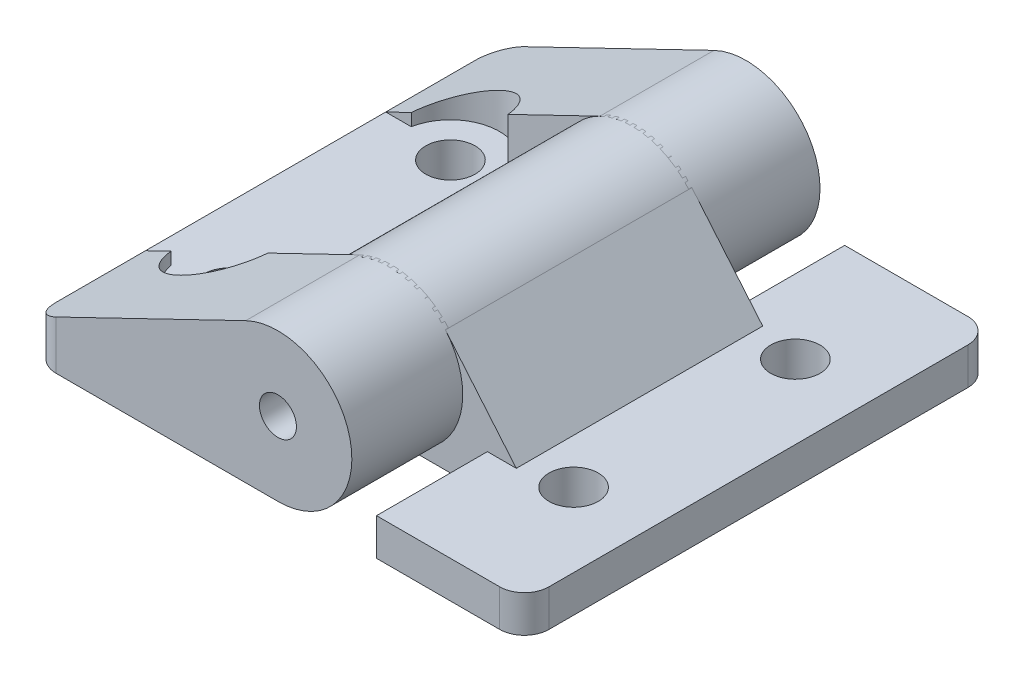
ISO-10303-21;
HEADER;
FILE_DESCRIPTION(('STEP AP214'),'2;1');
FILE_NAME('part.step','',(''),(''),'','','');
FILE_SCHEMA(('AUTOMOTIVE_DESIGN { 1 0 10303 214 1 1 1 1 }'));
ENDSEC;
DATA;
#1=APPLICATION_CONTEXT('core data for automotive mechanical design processes');
#2=APPLICATION_PROTOCOL_DEFINITION('international standard','automotive_design',2000,#1);
#3=PRODUCT_CONTEXT('',#1,'mechanical');
#4=PRODUCT('Part','Part','',(#3));
#5=PRODUCT_RELATED_PRODUCT_CATEGORY('part','',(#4));
#6=PRODUCT_DEFINITION_FORMATION('','',#4);
#7=PRODUCT_DEFINITION_CONTEXT('part definition',#1,'design');
#8=PRODUCT_DEFINITION('design','',#6,#7);
#9=PRODUCT_DEFINITION_SHAPE('','',#8);
#10=(LENGTH_UNIT() NAMED_UNIT(*) SI_UNIT(.MILLI.,.METRE.));
#11=(NAMED_UNIT(*) PLANE_ANGLE_UNIT() SI_UNIT($,.RADIAN.));
#12=(NAMED_UNIT(*) SI_UNIT($,.STERADIAN.) SOLID_ANGLE_UNIT());
#13=UNCERTAINTY_MEASURE_WITH_UNIT(LENGTH_MEASURE(1.E-05),#10,'distance_accuracy_value','');
#14=(GEOMETRIC_REPRESENTATION_CONTEXT(3) GLOBAL_UNCERTAINTY_ASSIGNED_CONTEXT((#13)) GLOBAL_UNIT_ASSIGNED_CONTEXT((#10,
#11,#12)) REPRESENTATION_CONTEXT('',''));
#15=CARTESIAN_POINT('',(0.,0.,0.));
#16=DIRECTION('',(0.,0.,1.));
#17=DIRECTION('',(1.,0.,0.));
#18=AXIS2_PLACEMENT_3D('',#15,#16,#17);
#19=CARTESIAN_POINT('',(-20.,-3.,19.));
#20=DIRECTION('',(0.435060204761574,-0.900401365077162,0.));
#21=DIRECTION('',(0.900401365077162,0.435060204761574,0.));
#22=AXIS2_PLACEMENT_3D('',#19,#20,#21);
#23=PLANE('',#22);
#24=DIRECTION('',(-0.900401365077162,-0.435060204761574,0.));
#25=VECTOR('',#24,1.);
#26=CARTESIAN_POINT('',(-20.,-3.,-19.));
#27=LINE('',#26,#25);
#28=CARTESIAN_POINT('',(-2.61036122856945,5.40240819046297,-19.));
#29=VERTEX_POINT('',#28);
#30=CARTESIAN_POINT('',(-18.,-2.03363050826941,-19.));
#31=VERTEX_POINT('',#30);
#32=EDGE_CURVE('E222',#29,#31,#27,.T.);
#33=ORIENTED_EDGE('',*,*,#32,.T.);
#34=CARTESIAN_POINT('',(-18.,-2.03363050826941,-17.));
#35=DIRECTION('',(0.435060204761574,-0.900401365077162,0.));
#36=DIRECTION('',(-0.900401365077162,-0.435060204761574,0.));
#37=AXIS2_PLACEMENT_3D('',#34,#35,#36);
#38=ELLIPSE('',#37,2.22123163910197,2.);
#39=CARTESIAN_POINT('',(-20.,-3.,-17.));
#40=VERTEX_POINT('',#39);
#41=EDGE_CURVE('E270',#31,#40,#38,.F.);
#42=ORIENTED_EDGE('',*,*,#41,.T.);
#43=DIRECTION('',(0.,0.,-1.));
#44=VECTOR('',#43,1.);
#45=CARTESIAN_POINT('',(-20.,-3.,19.));
#46=LINE('',#45,#44);
#47=CARTESIAN_POINT('',(-20.,-3.,-9.75));
#48=VERTEX_POINT('',#47);
#49=EDGE_CURVE('E234',#48,#40,#46,.T.);
#50=ORIENTED_EDGE('',*,*,#49,.F.);
#51=DIRECTION('',(0.900401365077162,0.435060204761574,0.));
#52=VECTOR('',#51,1.);
#53=CARTESIAN_POINT('',(-20.,-3.,-9.75));
#54=LINE('',#53,#52);
#55=CARTESIAN_POINT('',(-17.9290584113754,-1.99935261479857,-9.75));
#56=VERTEX_POINT('',#55);
#57=EDGE_CURVE('E255',#48,#56,#54,.T.);
#58=ORIENTED_EDGE('',*,*,#57,.T.);
#59=CARTESIAN_POINT('',(-14.,-0.100891524808225,-9.));
#60=DIRECTION('',(0.435060204761574,-0.900401365077162,0.));
#61=DIRECTION('',(-0.900401365077162,-0.435060204761574,0.));
#62=AXIS2_PLACEMENT_3D('',#59,#60,#61);
#63=ELLIPSE('',#62,4.44246327820395,4.);
#64=CARTESIAN_POINT('',(-10.0709415886246,1.79756956518212,-9.75));
#65=VERTEX_POINT('',#64);
#66=EDGE_CURVE('E253',#56,#65,#63,.T.);
#67=ORIENTED_EDGE('',*,*,#66,.T.);
#68=DIRECTION('',(0.900401365077162,0.435060204761574,0.));
#69=VECTOR('',#68,1.);
#70=CARTESIAN_POINT('',(-20.,-3.,-9.75));
#71=LINE('',#70,#69);
#72=CARTESIAN_POINT('',(-2.61036122856944,5.40240819046297,-9.75));
#73=VERTEX_POINT('',#72);
#74=EDGE_CURVE('E200',#65,#73,#71,.T.);
#75=ORIENTED_EDGE('',*,*,#74,.T.);
#76=DIRECTION('',(0.,0.,-1.));
#77=VECTOR('',#76,1.);
#78=CARTESIAN_POINT('',(-2.61036122856945,5.40240819046297,19.));
#79=LINE('',#78,#77);
#80=EDGE_CURVE('E240',#73,#29,#79,.T.);
#81=ORIENTED_EDGE('',*,*,#80,.T.);
#82=EDGE_LOOP('',(#33,#42,#50,#58,#67,#75,#81));
#83=FACE_BOUND('',#82,.T.);
#84=ADVANCED_FACE('F52',(#83),#23,.F.);
#85=CARTESIAN_POINT('',(0.,0.,19.));
#86=DIRECTION('',(0.,0.,-1.));
#87=DIRECTION('',(-1.,0.,0.));
#88=AXIS2_PLACEMENT_3D('',#85,#86,#87);
#89=CYLINDRICAL_SURFACE('',#88,6.);
#90=CARTESIAN_POINT('',(0.,0.,-9.75));
#91=DIRECTION('',(0.,0.,-1.));
#92=DIRECTION('',(-1.,0.,0.));
#93=AXIS2_PLACEMENT_3D('',#90,#91,#92);
#94=CIRCLE('',#93,6.);
#95=CARTESIAN_POINT('',(0.,-6.,-9.75));
#96=VERTEX_POINT('',#95);
#97=EDGE_CURVE('E198',#73,#96,#94,.T.);
#98=ORIENTED_EDGE('',*,*,#97,.T.);
#99=DIRECTION('',(0.,0.,-1.));
#100=VECTOR('',#99,1.);
#101=CARTESIAN_POINT('',(0.,-6.,19.));
#102=LINE('',#101,#100);
#103=CARTESIAN_POINT('',(0.,-6.,-19.));
#104=VERTEX_POINT('',#103);
#105=EDGE_CURVE('E221',#96,#104,#102,.T.);
#106=ORIENTED_EDGE('',*,*,#105,.T.);
#107=CARTESIAN_POINT('',(0.,0.,-19.));
#108=DIRECTION('',(0.,0.,1.));
#109=DIRECTION('',(1.,0.,0.));
#110=AXIS2_PLACEMENT_3D('',#107,#108,#109);
#111=CIRCLE('',#110,6.);
#112=EDGE_CURVE('E212',#104,#29,#111,.T.);
#113=ORIENTED_EDGE('',*,*,#112,.T.);
#114=ORIENTED_EDGE('',*,*,#80,.F.);
#115=EDGE_LOOP('',(#98,#106,#113,#114));
#116=FACE_BOUND('',#115,.T.);
#117=ADVANCED_FACE('F311',(#116),#89,.T.);
#118=CARTESIAN_POINT('',(0.,0.,19.));
#119=DIRECTION('',(0.,0.,-1.));
#120=DIRECTION('',(-1.,0.,0.));
#121=AXIS2_PLACEMENT_3D('',#118,#119,#120);
#122=CYLINDRICAL_SURFACE('',#121,1.5);
#123=CARTESIAN_POINT('',(0.,0.,9.75));
#124=DIRECTION('',(0.,0.,1.));
#125=DIRECTION('',(1.,0.,0.));
#126=AXIS2_PLACEMENT_3D('',#123,#124,#125);
#127=CIRCLE('',#126,1.5);
#128=CARTESIAN_POINT('',(1.5,0.,9.75));
#129=VERTEX_POINT('',#128);
#130=EDGE_CURVE('E201',#129,#129,#127,.T.);
#131=ORIENTED_EDGE('',*,*,#130,.F.);
#132=EDGE_LOOP('',(#131));
#133=FACE_BOUND('',#132,.T.);
#134=CARTESIAN_POINT('',(0.,0.,19.));
#135=DIRECTION('',(0.,0.,1.));
#136=DIRECTION('',(1.,0.,0.));
#137=AXIS2_PLACEMENT_3D('',#134,#135,#136);
#138=CIRCLE('',#137,1.5);
#139=CARTESIAN_POINT('',(1.5,0.,19.));
#140=VERTEX_POINT('',#139);
#141=EDGE_CURVE('E206',#140,#140,#138,.T.);
#142=ORIENTED_EDGE('',*,*,#141,.T.);
#143=EDGE_LOOP('',(#142));
#144=FACE_BOUND('',#143,.T.);
#145=ADVANCED_FACE('F378',(#133,#144),#122,.F.);
#146=CARTESIAN_POINT('',(0.,0.,19.));
#147=DIRECTION('',(0.,0.,1.));
#148=DIRECTION('',(1.,0.,0.));
#149=AXIS2_PLACEMENT_3D('',#146,#147,#148);
#150=PLANE('',#149);
#151=DIRECTION('',(-0.900401365077162,-0.435060204761574,0.));
#152=VECTOR('',#151,1.);
#153=CARTESIAN_POINT('',(-20.,-3.,19.));
#154=LINE('',#153,#152);
#155=CARTESIAN_POINT('',(-2.61036122856945,5.40240819046297,19.));
#156=VERTEX_POINT('',#155);
#157=CARTESIAN_POINT('',(-18.,-2.03363050826941,19.));
#158=VERTEX_POINT('',#157);
#159=EDGE_CURVE('E220',#156,#158,#154,.T.);
#160=ORIENTED_EDGE('',*,*,#159,.T.);
#161=DIRECTION('',(0.,-1.,0.));
#162=VECTOR('',#161,1.);
#163=CARTESIAN_POINT('',(-18.,-6.,19.));
#164=LINE('',#163,#162);
#165=CARTESIAN_POINT('',(-18.,-6.,19.));
#166=VERTEX_POINT('',#165);
#167=EDGE_CURVE('E62',#158,#166,#164,.T.);
#168=ORIENTED_EDGE('',*,*,#167,.T.);
#169=DIRECTION('',(1.,0.,0.));
#170=VECTOR('',#169,1.);
#171=CARTESIAN_POINT('',(0.,-6.,19.));
#172=LINE('',#171,#170);
#173=CARTESIAN_POINT('',(0.,-6.,19.));
#174=VERTEX_POINT('',#173);
#175=EDGE_CURVE('E218',#166,#174,#172,.T.);
#176=ORIENTED_EDGE('',*,*,#175,.T.);
#177=CARTESIAN_POINT('',(0.,0.,19.));
#178=DIRECTION('',(0.,0.,1.));
#179=DIRECTION('',(1.,0.,0.));
#180=AXIS2_PLACEMENT_3D('',#177,#178,#179);
#181=CIRCLE('',#180,6.);
#182=EDGE_CURVE('E211',#174,#156,#181,.T.);
#183=ORIENTED_EDGE('',*,*,#182,.T.);
#184=EDGE_LOOP('',(#160,#168,#176,#183));
#185=FACE_BOUND('',#184,.T.);
#186=ORIENTED_EDGE('',*,*,#141,.F.);
#187=EDGE_LOOP('',(#186));
#188=FACE_BOUND('',#187,.T.);
#189=ADVANCED_FACE('F271',(#185,#188),#150,.T.);
#190=CARTESIAN_POINT('',(0.,0.,-19.));
#191=DIRECTION('',(0.,0.,1.));
#192=DIRECTION('',(1.,0.,0.));
#193=AXIS2_PLACEMENT_3D('',#190,#191,#192);
#194=PLANE('',#193);
#195=DIRECTION('',(1.,0.,0.));
#196=VECTOR('',#195,1.);
#197=CARTESIAN_POINT('',(0.,-6.,-19.));
#198=LINE('',#197,#196);
#199=CARTESIAN_POINT('',(-18.,-6.,-19.));
#200=VERTEX_POINT('',#199);
#201=EDGE_CURVE('E219',#200,#104,#198,.T.);
#202=ORIENTED_EDGE('',*,*,#201,.F.);
#203=DIRECTION('',(0.,-1.,0.));
#204=VECTOR('',#203,1.);
#205=CARTESIAN_POINT('',(-18.,0.,-19.));
#206=LINE('',#205,#204);
#207=EDGE_CURVE('E73',#200,#31,#206,.F.);
#208=ORIENTED_EDGE('',*,*,#207,.T.);
#209=ORIENTED_EDGE('',*,*,#32,.F.);
#210=ORIENTED_EDGE('',*,*,#112,.F.);
#211=EDGE_LOOP('',(#202,#208,#209,#210));
#212=FACE_BOUND('',#211,.T.);
#213=CARTESIAN_POINT('',(0.,0.,-19.));
#214=DIRECTION('',(0.,0.,1.));
#215=DIRECTION('',(1.,0.,0.));
#216=AXIS2_PLACEMENT_3D('',#213,#214,#215);
#217=CIRCLE('',#216,1.5);
#218=CARTESIAN_POINT('',(1.5,0.,-19.));
#219=VERTEX_POINT('',#218);
#220=EDGE_CURVE('E210',#219,#219,#217,.T.);
#221=ORIENTED_EDGE('',*,*,#220,.T.);
#222=EDGE_LOOP('',(#221));
#223=FACE_BOUND('',#222,.T.);
#224=ADVANCED_FACE('F312',(#212,#223),#194,.F.);
#225=CARTESIAN_POINT('',(0.,0.,9.75));
#226=DIRECTION('',(0.,0.,1.));
#227=DIRECTION('',(1.,0.,0.));
#228=AXIS2_PLACEMENT_3D('',#225,#226,#227);
#229=CIRCLE('',#228,6.);
#230=CARTESIAN_POINT('',(0.,-6.,9.75));
#231=VERTEX_POINT('',#230);
#232=CARTESIAN_POINT('',(-2.61036122856944,5.40240819046297,9.75));
#233=VERTEX_POINT('',#232);
#234=EDGE_CURVE('E202',#231,#233,#229,.T.);
#235=ORIENTED_EDGE('',*,*,#234,.T.);
#236=EDGE_CURVE('E237',#156,#233,#79,.T.);
#237=ORIENTED_EDGE('',*,*,#236,.F.);
#238=ORIENTED_EDGE('',*,*,#182,.F.);
#239=EDGE_CURVE('E226',#174,#231,#102,.T.);
#240=ORIENTED_EDGE('',*,*,#239,.T.);
#241=EDGE_LOOP('',(#235,#237,#238,#240));
#242=FACE_BOUND('',#241,.T.);
#243=ADVANCED_FACE('F284',(#242),#89,.T.);
#244=CARTESIAN_POINT('',(-20.,-3.,17.));
#245=VERTEX_POINT('',#244);
#246=CARTESIAN_POINT('',(-20.,-3.,9.75));
#247=VERTEX_POINT('',#246);
#248=EDGE_CURVE('E232',#245,#247,#46,.T.);
#249=ORIENTED_EDGE('',*,*,#248,.F.);
#250=CARTESIAN_POINT('',(-18.,-2.03363050826941,17.));
#251=DIRECTION('',(0.435060204761574,-0.900401365077162,0.));
#252=DIRECTION('',(0.900401365077162,0.435060204761574,0.));
#253=AXIS2_PLACEMENT_3D('',#250,#251,#252);
#254=ELLIPSE('',#253,2.22123163910197,2.);
#255=EDGE_CURVE('E12',#245,#158,#254,.F.);
#256=ORIENTED_EDGE('',*,*,#255,.T.);
#257=ORIENTED_EDGE('',*,*,#159,.F.);
#258=ORIENTED_EDGE('',*,*,#236,.T.);
#259=DIRECTION('',(-0.900401365077162,-0.435060204761574,0.));
#260=VECTOR('',#259,1.);
#261=CARTESIAN_POINT('',(-20.,-3.,9.75));
#262=LINE('',#261,#260);
#263=CARTESIAN_POINT('',(-10.0709415886246,1.79756956518211,9.75));
#264=VERTEX_POINT('',#263);
#265=EDGE_CURVE('E205',#233,#264,#262,.T.);
#266=ORIENTED_EDGE('',*,*,#265,.T.);
#267=CARTESIAN_POINT('',(-14.,-0.100891524808227,9.));
#268=DIRECTION('',(0.435060204761574,-0.900401365077162,0.));
#269=DIRECTION('',(-0.900401365077162,-0.435060204761574,0.));
#270=AXIS2_PLACEMENT_3D('',#267,#268,#269);
#271=ELLIPSE('',#270,4.44246327820395,4.);
#272=CARTESIAN_POINT('',(-17.9290584113754,-1.99935261479856,9.75));
#273=VERTEX_POINT('',#272);
#274=EDGE_CURVE('E245',#264,#273,#271,.T.);
#275=ORIENTED_EDGE('',*,*,#274,.T.);
#276=DIRECTION('',(-0.900401365077162,-0.435060204761574,0.));
#277=VECTOR('',#276,1.);
#278=CARTESIAN_POINT('',(-20.,-3.,9.75));
#279=LINE('',#278,#277);
#280=EDGE_CURVE('E248',#273,#247,#279,.T.);
#281=ORIENTED_EDGE('',*,*,#280,.T.);
#282=EDGE_LOOP('',(#249,#256,#257,#258,#266,#275,#281));
#283=FACE_BOUND('',#282,.T.);
#284=ADVANCED_FACE('F283',(#283),#23,.F.);
#285=CARTESIAN_POINT('',(-20.,-6.,19.));
#286=DIRECTION('',(1.,0.,0.));
#287=DIRECTION('',(0.,0.,-1.));
#288=AXIS2_PLACEMENT_3D('',#285,#286,#287);
#289=PLANE('',#288);
#290=ORIENTED_EDGE('',*,*,#49,.T.);
#291=DIRECTION('',(0.,-1.,0.));
#292=VECTOR('',#291,1.);
#293=CARTESIAN_POINT('',(-20.,-6.,-17.));
#294=LINE('',#293,#292);
#295=CARTESIAN_POINT('',(-20.,-6.,-17.));
#296=VERTEX_POINT('',#295);
#297=EDGE_CURVE('E258',#40,#296,#294,.T.);
#298=ORIENTED_EDGE('',*,*,#297,.T.);
#299=DIRECTION('',(0.,0.,-1.));
#300=VECTOR('',#299,1.);
#301=CARTESIAN_POINT('',(-20.,-6.,19.));
#302=LINE('',#301,#300);
#303=CARTESIAN_POINT('',(-20.,-6.,17.));
#304=VERTEX_POINT('',#303);
#305=EDGE_CURVE('E233',#304,#296,#302,.T.);
#306=ORIENTED_EDGE('',*,*,#305,.F.);
#307=DIRECTION('',(0.,-1.,0.));
#308=VECTOR('',#307,1.);
#309=CARTESIAN_POINT('',(-20.,-3.,17.));
#310=LINE('',#309,#308);
#311=EDGE_CURVE('E259',#304,#245,#310,.F.);
#312=ORIENTED_EDGE('',*,*,#311,.T.);
#313=ORIENTED_EDGE('',*,*,#248,.T.);
#314=EDGE_CURVE('E238',#247,#48,#46,.T.);
#315=ORIENTED_EDGE('',*,*,#314,.T.);
#316=EDGE_LOOP('',(#290,#298,#306,#312,#313,#315));
#317=FACE_BOUND('',#316,.T.);
#318=ADVANCED_FACE('F325',(#317),#289,.F.);
#319=CARTESIAN_POINT('',(0.,-6.,19.));
#320=DIRECTION('',(0.,1.,0.));
#321=DIRECTION('',(-1.,0.,0.));
#322=AXIS2_PLACEMENT_3D('',#319,#320,#321);
#323=PLANE('',#322);
#324=CARTESIAN_POINT('',(-14.,-6.00000000000001,-9.));
#325=DIRECTION('',(0.,1.,0.));
#326=DIRECTION('',(-1.,0.,0.));
#327=AXIS2_PLACEMENT_3D('',#324,#325,#326);
#328=CIRCLE('',#327,2.);
#329=CARTESIAN_POINT('',(-16.,-6.00000000000001,-9.));
#330=VERTEX_POINT('',#329);
#331=EDGE_CURVE('E182',#330,#330,#328,.T.);
#332=ORIENTED_EDGE('',*,*,#331,.T.);
#333=EDGE_LOOP('',(#332));
#334=FACE_BOUND('',#333,.T.);
#335=CARTESIAN_POINT('',(-14.,-6.00000000000001,9.));
#336=DIRECTION('',(0.,1.,0.));
#337=DIRECTION('',(-1.,0.,0.));
#338=AXIS2_PLACEMENT_3D('',#335,#336,#337);
#339=CIRCLE('',#338,2.);
#340=CARTESIAN_POINT('',(-16.,-6.00000000000001,9.));
#341=VERTEX_POINT('',#340);
#342=EDGE_CURVE('E342',#341,#341,#339,.T.);
#343=ORIENTED_EDGE('',*,*,#342,.T.);
#344=EDGE_LOOP('',(#343));
#345=FACE_BOUND('',#344,.T.);
#346=ORIENTED_EDGE('',*,*,#305,.T.);
#347=CARTESIAN_POINT('',(-18.,-6.,-17.));
#348=DIRECTION('',(0.,1.,0.));
#349=DIRECTION('',(-1.,0.,0.));
#350=AXIS2_PLACEMENT_3D('',#347,#348,#349);
#351=CIRCLE('',#350,2.);
#352=EDGE_CURVE('E263',#296,#200,#351,.F.);
#353=ORIENTED_EDGE('',*,*,#352,.T.);
#354=ORIENTED_EDGE('',*,*,#201,.T.);
#355=ORIENTED_EDGE('',*,*,#105,.F.);
#356=DIRECTION('',(-1.,0.,0.));
#357=VECTOR('',#356,1.);
#358=CARTESIAN_POINT('',(-6.5,-6.,-9.75));
#359=LINE('',#358,#357);
#360=CARTESIAN_POINT('',(-6.5,-6.,-9.75));
#361=VERTEX_POINT('',#360);
#362=EDGE_CURVE('E302',#96,#361,#359,.T.);
#363=ORIENTED_EDGE('',*,*,#362,.T.);
#364=DIRECTION('',(0.,0.,1.));
#365=VECTOR('',#364,1.);
#366=CARTESIAN_POINT('',(-6.5,-6.,-9.75));
#367=LINE('',#366,#365);
#368=CARTESIAN_POINT('',(-6.5,-6.,9.75));
#369=VERTEX_POINT('',#368);
#370=EDGE_CURVE('E190',#361,#369,#367,.T.);
#371=ORIENTED_EDGE('',*,*,#370,.T.);
#372=DIRECTION('',(1.,0.,0.));
#373=VECTOR('',#372,1.);
#374=CARTESIAN_POINT('',(-6.5,-6.,9.75));
#375=LINE('',#374,#373);
#376=EDGE_CURVE('E188',#369,#231,#375,.T.);
#377=ORIENTED_EDGE('',*,*,#376,.T.);
#378=ORIENTED_EDGE('',*,*,#239,.F.);
#379=ORIENTED_EDGE('',*,*,#175,.F.);
#380=CARTESIAN_POINT('',(-18.,-6.,17.));
#381=DIRECTION('',(0.,1.,0.));
#382=DIRECTION('',(-1.,0.,0.));
#383=AXIS2_PLACEMENT_3D('',#380,#381,#382);
#384=CIRCLE('',#383,2.);
#385=EDGE_CURVE('E264',#166,#304,#384,.F.);
#386=ORIENTED_EDGE('',*,*,#385,.T.);
#387=EDGE_LOOP('',(#346,#353,#354,#355,#363,#371,#377,#378,#379,#386));
#388=FACE_BOUND('',#387,.T.);
#389=ADVANCED_FACE('F279',(#334,#345,#388),#323,.F.);
#390=CARTESIAN_POINT('',(0.,0.,-9.75));
#391=DIRECTION('',(0.,0.,-1.));
#392=DIRECTION('',(-1.,0.,0.));
#393=AXIS2_PLACEMENT_3D('',#390,#391,#392);
#394=CIRCLE('',#393,1.5);
#395=CARTESIAN_POINT('',(-1.5,0.,-9.75));
#396=VERTEX_POINT('',#395);
#397=EDGE_CURVE('E195',#396,#396,#394,.T.);
#398=ORIENTED_EDGE('',*,*,#397,.F.);
#399=EDGE_LOOP('',(#398));
#400=FACE_BOUND('',#399,.T.);
#401=ORIENTED_EDGE('',*,*,#220,.F.);
#402=EDGE_LOOP('',(#401));
#403=FACE_BOUND('',#402,.T.);
#404=ADVANCED_FACE('F423',(#400,#403),#122,.F.);
#405=CARTESIAN_POINT('',(-6.5,-6.,-9.75));
#406=DIRECTION('',(-1.,0.,0.));
#407=DIRECTION('',(0.,0.,1.));
#408=AXIS2_PLACEMENT_3D('',#405,#406,#407);
#409=PLANE('',#408);
#410=DIRECTION('',(0.,1.,0.));
#411=VECTOR('',#410,1.);
#412=CARTESIAN_POINT('',(-6.5,-6.,-9.75));
#413=LINE('',#412,#411);
#414=CARTESIAN_POINT('',(-6.5,-3.,-9.75));
#415=VERTEX_POINT('',#414);
#416=EDGE_CURVE('E177',#361,#415,#413,.T.);
#417=ORIENTED_EDGE('',*,*,#416,.T.);
#418=DIRECTION('',(0.,0.,1.));
#419=VECTOR('',#418,1.);
#420=CARTESIAN_POINT('',(-6.5,-3.,9.75));
#421=LINE('',#420,#419);
#422=CARTESIAN_POINT('',(-6.5,-3.,9.75));
#423=VERTEX_POINT('',#422);
#424=EDGE_CURVE('E163',#415,#423,#421,.T.);
#425=ORIENTED_EDGE('',*,*,#424,.T.);
#426=DIRECTION('',(0.,1.,0.));
#427=VECTOR('',#426,1.);
#428=CARTESIAN_POINT('',(-6.5,-6.,9.75));
#429=LINE('',#428,#427);
#430=EDGE_CURVE('E186',#369,#423,#429,.T.);
#431=ORIENTED_EDGE('',*,*,#430,.F.);
#432=ORIENTED_EDGE('',*,*,#370,.F.);
#433=EDGE_LOOP('',(#417,#425,#431,#432));
#434=FACE_BOUND('',#433,.T.);
#435=ADVANCED_FACE('F184',(#434),#409,.F.);
#436=CARTESIAN_POINT('',(-6.5,-6.,9.75));
#437=DIRECTION('',(0.,0.,1.));
#438=DIRECTION('',(1.,0.,0.));
#439=AXIS2_PLACEMENT_3D('',#436,#437,#438);
#440=PLANE('',#439);
#441=ORIENTED_EDGE('',*,*,#130,.T.);
#442=EDGE_LOOP('',(#441));
#443=FACE_BOUND('',#442,.T.);
#444=ORIENTED_EDGE('',*,*,#376,.F.);
#445=ORIENTED_EDGE('',*,*,#430,.T.);
#446=DIRECTION('',(-1.,0.,0.));
#447=VECTOR('',#446,1.);
#448=CARTESIAN_POINT('',(-10.0709415886246,-3.,9.75));
#449=LINE('',#448,#447);
#450=CARTESIAN_POINT('',(-10.0709415886246,-3.,9.75));
#451=VERTEX_POINT('',#450);
#452=EDGE_CURVE('E167',#423,#451,#449,.T.);
#453=ORIENTED_EDGE('',*,*,#452,.T.);
#454=DIRECTION('',(0.,-1.,0.));
#455=VECTOR('',#454,1.);
#456=CARTESIAN_POINT('',(-10.0709415886246,6.,9.75));
#457=LINE('',#456,#455);
#458=EDGE_CURVE('E291',#264,#451,#457,.T.);
#459=ORIENTED_EDGE('',*,*,#458,.F.);
#460=ORIENTED_EDGE('',*,*,#265,.F.);
#461=ORIENTED_EDGE('',*,*,#234,.F.);
#462=EDGE_LOOP('',(#444,#445,#453,#459,#460,#461));
#463=FACE_BOUND('',#462,.T.);
#464=ADVANCED_FACE('F294',(#443,#463),#440,.F.);
#465=CARTESIAN_POINT('',(-6.5,-6.,-9.75));
#466=DIRECTION('',(0.,0.,-1.));
#467=DIRECTION('',(-1.,0.,0.));
#468=AXIS2_PLACEMENT_3D('',#465,#466,#467);
#469=PLANE('',#468);
#470=ORIENTED_EDGE('',*,*,#397,.T.);
#471=EDGE_LOOP('',(#470));
#472=FACE_BOUND('',#471,.T.);
#473=ORIENTED_EDGE('',*,*,#97,.F.);
#474=ORIENTED_EDGE('',*,*,#74,.F.);
#475=DIRECTION('',(0.,-1.,0.));
#476=VECTOR('',#475,1.);
#477=CARTESIAN_POINT('',(-10.0709415886246,6.,-9.75));
#478=LINE('',#477,#476);
#479=CARTESIAN_POINT('',(-10.0709415886246,-3.,-9.75));
#480=VERTEX_POINT('',#479);
#481=EDGE_CURVE('E185',#65,#480,#478,.T.);
#482=ORIENTED_EDGE('',*,*,#481,.T.);
#483=DIRECTION('',(1.,0.,0.));
#484=VECTOR('',#483,1.);
#485=CARTESIAN_POINT('',(-10.0709415886246,-3.,-9.75));
#486=LINE('',#485,#484);
#487=EDGE_CURVE('E168',#480,#415,#486,.T.);
#488=ORIENTED_EDGE('',*,*,#487,.T.);
#489=ORIENTED_EDGE('',*,*,#416,.F.);
#490=ORIENTED_EDGE('',*,*,#362,.F.);
#491=EDGE_LOOP('',(#473,#474,#482,#488,#489,#490));
#492=FACE_BOUND('',#491,.T.);
#493=ADVANCED_FACE('F180',(#472,#492),#469,.F.);
#494=CARTESIAN_POINT('',(-14.,6.,-9.));
#495=DIRECTION('',(0.,-1.,0.));
#496=DIRECTION('',(1.,0.,0.));
#497=AXIS2_PLACEMENT_3D('',#494,#495,#496);
#498=CYLINDRICAL_SURFACE('',#497,4.);
#499=DIRECTION('',(0.,-1.,0.));
#500=VECTOR('',#499,1.);
#501=CARTESIAN_POINT('',(-17.9290584113754,6.,-9.75));
#502=LINE('',#501,#500);
#503=CARTESIAN_POINT('',(-17.9290584113754,-3.,-9.75));
#504=VERTEX_POINT('',#503);
#505=EDGE_CURVE('E296',#56,#504,#502,.T.);
#506=ORIENTED_EDGE('',*,*,#505,.T.);
#507=CARTESIAN_POINT('',(-14.,-3.,-9.));
#508=DIRECTION('',(0.,-1.,0.));
#509=DIRECTION('',(-1.,0.,0.));
#510=AXIS2_PLACEMENT_3D('',#507,#508,#509);
#511=CIRCLE('',#510,4.);
#512=EDGE_CURVE('E298',#504,#480,#511,.T.);
#513=ORIENTED_EDGE('',*,*,#512,.T.);
#514=ORIENTED_EDGE('',*,*,#481,.F.);
#515=ORIENTED_EDGE('',*,*,#66,.F.);
#516=EDGE_LOOP('',(#506,#513,#514,#515));
#517=FACE_BOUND('',#516,.T.);
#518=ADVANCED_FACE('F405',(#517),#498,.F.);
#519=CARTESIAN_POINT('',(-33.5,6.,-9.75));
#520=DIRECTION('',(0.,0.,-1.));
#521=DIRECTION('',(-1.,0.,0.));
#522=AXIS2_PLACEMENT_3D('',#519,#520,#521);
#523=PLANE('',#522);
#524=DIRECTION('',(1.,0.,0.));
#525=VECTOR('',#524,1.);
#526=CARTESIAN_POINT('',(-33.5,-3.,-9.75));
#527=LINE('',#526,#525);
#528=EDGE_CURVE('E297',#48,#504,#527,.T.);
#529=ORIENTED_EDGE('',*,*,#528,.T.);
#530=ORIENTED_EDGE('',*,*,#505,.F.);
#531=ORIENTED_EDGE('',*,*,#57,.F.);
#532=EDGE_LOOP('',(#529,#530,#531));
#533=FACE_BOUND('',#532,.T.);
#534=ADVANCED_FACE('F328',(#533),#523,.F.);
#535=CARTESIAN_POINT('',(-33.5,6.,9.75));
#536=DIRECTION('',(0.,0.,1.));
#537=DIRECTION('',(1.,0.,0.));
#538=AXIS2_PLACEMENT_3D('',#535,#536,#537);
#539=PLANE('',#538);
#540=DIRECTION('',(0.,-1.,0.));
#541=VECTOR('',#540,1.);
#542=CARTESIAN_POINT('',(-17.9290584113754,6.,9.75));
#543=LINE('',#542,#541);
#544=CARTESIAN_POINT('',(-17.9290584113754,-3.,9.75));
#545=VERTEX_POINT('',#544);
#546=EDGE_CURVE('E295',#273,#545,#543,.T.);
#547=ORIENTED_EDGE('',*,*,#546,.T.);
#548=DIRECTION('',(-1.,0.,0.));
#549=VECTOR('',#548,1.);
#550=CARTESIAN_POINT('',(-33.5,-3.,9.75));
#551=LINE('',#550,#549);
#552=EDGE_CURVE('E332',#545,#247,#551,.T.);
#553=ORIENTED_EDGE('',*,*,#552,.T.);
#554=ORIENTED_EDGE('',*,*,#280,.F.);
#555=EDGE_LOOP('',(#547,#553,#554));
#556=FACE_BOUND('',#555,.T.);
#557=ADVANCED_FACE('F402',(#556),#539,.F.);
#558=CARTESIAN_POINT('',(-14.,6.,9.));
#559=DIRECTION('',(0.,-1.,0.));
#560=DIRECTION('',(1.,0.,0.));
#561=AXIS2_PLACEMENT_3D('',#558,#559,#560);
#562=CYLINDRICAL_SURFACE('',#561,4.);
#563=ORIENTED_EDGE('',*,*,#458,.T.);
#564=CARTESIAN_POINT('',(-14.,-3.,9.));
#565=DIRECTION('',(0.,-1.,0.));
#566=DIRECTION('',(1.,0.,0.));
#567=AXIS2_PLACEMENT_3D('',#564,#565,#566);
#568=CIRCLE('',#567,4.);
#569=EDGE_CURVE('E336',#451,#545,#568,.T.);
#570=ORIENTED_EDGE('',*,*,#569,.T.);
#571=ORIENTED_EDGE('',*,*,#546,.F.);
#572=ORIENTED_EDGE('',*,*,#274,.F.);
#573=EDGE_LOOP('',(#563,#570,#571,#572));
#574=FACE_BOUND('',#573,.T.);
#575=ADVANCED_FACE('F293',(#574),#562,.F.);
#576=CARTESIAN_POINT('',(-14.,-3.,9.));
#577=DIRECTION('',(0.,-1.,0.));
#578=DIRECTION('',(1.,0.,0.));
#579=AXIS2_PLACEMENT_3D('',#576,#577,#578);
#580=PLANE('',#579);
#581=CARTESIAN_POINT('',(-14.,-3.,-9.));
#582=DIRECTION('',(0.,1.,0.));
#583=DIRECTION('',(-1.,0.,0.));
#584=AXIS2_PLACEMENT_3D('',#581,#582,#583);
#585=CIRCLE('',#584,2.);
#586=CARTESIAN_POINT('',(-16.,-3.,-9.));
#587=VERTEX_POINT('',#586);
#588=EDGE_CURVE('E350',#587,#587,#585,.T.);
#589=ORIENTED_EDGE('',*,*,#588,.F.);
#590=EDGE_LOOP('',(#589));
#591=FACE_BOUND('',#590,.T.);
#592=CARTESIAN_POINT('',(-14.,-3.,9.));
#593=DIRECTION('',(0.,1.,0.));
#594=DIRECTION('',(-1.,0.,0.));
#595=AXIS2_PLACEMENT_3D('',#592,#593,#594);
#596=CIRCLE('',#595,2.);
#597=CARTESIAN_POINT('',(-16.,-3.,9.));
#598=VERTEX_POINT('',#597);
#599=EDGE_CURVE('E341',#598,#598,#596,.T.);
#600=ORIENTED_EDGE('',*,*,#599,.F.);
#601=EDGE_LOOP('',(#600));
#602=FACE_BOUND('',#601,.T.);
#603=ORIENTED_EDGE('',*,*,#552,.F.);
#604=ORIENTED_EDGE('',*,*,#569,.F.);
#605=ORIENTED_EDGE('',*,*,#452,.F.);
#606=ORIENTED_EDGE('',*,*,#424,.F.);
#607=ORIENTED_EDGE('',*,*,#487,.F.);
#608=ORIENTED_EDGE('',*,*,#512,.F.);
#609=ORIENTED_EDGE('',*,*,#528,.F.);
#610=ORIENTED_EDGE('',*,*,#314,.F.);
#611=EDGE_LOOP('',(#603,#604,#605,#606,#607,#608,#609,#610));
#612=FACE_BOUND('',#611,.T.);
#613=ADVANCED_FACE('F165',(#591,#602,#612),#580,.F.);
#614=CARTESIAN_POINT('',(-14.,-6.00000000000001,9.));
#615=DIRECTION('',(0.,1.,0.));
#616=DIRECTION('',(-1.,0.,0.));
#617=AXIS2_PLACEMENT_3D('',#614,#615,#616);
#618=CYLINDRICAL_SURFACE('',#617,2.);
#619=ORIENTED_EDGE('',*,*,#342,.F.);
#620=EDGE_LOOP('',(#619));
#621=FACE_BOUND('',#620,.T.);
#622=ORIENTED_EDGE('',*,*,#599,.T.);
#623=EDGE_LOOP('',(#622));
#624=FACE_BOUND('',#623,.T.);
#625=ADVANCED_FACE('F356',(#621,#624),#618,.F.);
#626=CARTESIAN_POINT('',(-14.,-6.00000000000001,-9.));
#627=DIRECTION('',(0.,1.,0.));
#628=DIRECTION('',(-1.,0.,0.));
#629=AXIS2_PLACEMENT_3D('',#626,#627,#628);
#630=CYLINDRICAL_SURFACE('',#629,2.);
#631=ORIENTED_EDGE('',*,*,#331,.F.);
#632=EDGE_LOOP('',(#631));
#633=FACE_BOUND('',#632,.T.);
#634=ORIENTED_EDGE('',*,*,#588,.T.);
#635=EDGE_LOOP('',(#634));
#636=FACE_BOUND('',#635,.T.);
#637=ADVANCED_FACE('F352',(#633,#636),#630,.F.);
#638=CARTESIAN_POINT('',(-18.,-6.,-17.));
#639=DIRECTION('',(0.,-1.,0.));
#640=DIRECTION('',(0.,0.,-1.));
#641=AXIS2_PLACEMENT_3D('',#638,#639,#640);
#642=CYLINDRICAL_SURFACE('',#641,2.);
#643=ORIENTED_EDGE('',*,*,#41,.F.);
#644=ORIENTED_EDGE('',*,*,#207,.F.);
#645=ORIENTED_EDGE('',*,*,#352,.F.);
#646=ORIENTED_EDGE('',*,*,#297,.F.);
#647=EDGE_LOOP('',(#643,#644,#645,#646));
#648=FACE_BOUND('',#647,.T.);
#649=ADVANCED_FACE('F318',(#648),#642,.T.);
#650=CARTESIAN_POINT('',(-18.,0.,17.));
#651=DIRECTION('',(0.,1.,0.));
#652=DIRECTION('',(0.,0.,1.));
#653=AXIS2_PLACEMENT_3D('',#650,#651,#652);
#654=CYLINDRICAL_SURFACE('',#653,2.);
#655=ORIENTED_EDGE('',*,*,#255,.F.);
#656=ORIENTED_EDGE('',*,*,#311,.F.);
#657=ORIENTED_EDGE('',*,*,#385,.F.);
#658=ORIENTED_EDGE('',*,*,#167,.F.);
#659=EDGE_LOOP('',(#655,#656,#657,#658));
#660=FACE_BOUND('',#659,.T.);
#661=ADVANCED_FACE('F54',(#660),#654,.T.);
#662=CLOSED_SHELL('',(#84,#117,#145,#189,#224,#243,#284,#318,#389,#404,#435,#464,#493,#518,#534,
#557,#575,#613,#625,#637,#649,#661));
#663=MANIFOLD_SOLID_BREP('B2',#662);
#664=CARTESIAN_POINT('',(0.,0.,10.));
#665=DIRECTION('',(0.,0.,1.));
#666=DIRECTION('',(1.,0.,0.));
#667=AXIS2_PLACEMENT_3D('',#664,#665,#666);
#668=PLANE('',#667);
#669=DIRECTION('',(0.,-1.,0.));
#670=VECTOR('',#669,1.);
#671=CARTESIAN_POINT('',(8.,0.,10.));
#672=LINE('',#671,#670);
#673=CARTESIAN_POINT('',(8.,-3.,10.));
#674=VERTEX_POINT('',#673);
#675=CARTESIAN_POINT('',(8.,-6.,10.));
#676=VERTEX_POINT('',#675);
#677=EDGE_CURVE('E648',#674,#676,#672,.T.);
#678=ORIENTED_EDGE('',*,*,#677,.F.);
#679=DIRECTION('',(-1.,0.,0.));
#680=VECTOR('',#679,1.);
#681=CARTESIAN_POINT('',(0.,-3.,10.));
#682=LINE('',#681,#680);
#683=CARTESIAN_POINT('',(10.3497426295256,-3.,10.));
#684=VERTEX_POINT('',#683);
#685=EDGE_CURVE('E682',#684,#674,#682,.T.);
#686=ORIENTED_EDGE('',*,*,#685,.F.);
#687=DIRECTION('',(-0.642787609686542,0.766044443118975,0.));
#688=VECTOR('',#687,1.);
#689=CARTESIAN_POINT('',(10.3497426295256,-3.,10.));
#690=LINE('',#689,#688);
#691=CARTESIAN_POINT('',(4.59626665871385,3.85672565811926,10.));
#692=VERTEX_POINT('',#691);
#693=EDGE_CURVE('E697',#684,#692,#690,.T.);
#694=ORIENTED_EDGE('',*,*,#693,.T.);
#695=CARTESIAN_POINT('',(0.,0.,10.));
#696=DIRECTION('',(0.,0.,1.));
#697=DIRECTION('',(1.,0.,0.));
#698=AXIS2_PLACEMENT_3D('',#695,#696,#697);
#699=CIRCLE('',#698,6.);
#700=CARTESIAN_POINT('',(0.,-6.,10.));
#701=VERTEX_POINT('',#700);
#702=EDGE_CURVE('E693',#692,#701,#699,.T.);
#703=ORIENTED_EDGE('',*,*,#702,.T.);
#704=DIRECTION('',(1.,0.,0.));
#705=VECTOR('',#704,1.);
#706=CARTESIAN_POINT('',(0.,-6.,10.));
#707=LINE('',#706,#705);
#708=EDGE_CURVE('E696',#701,#676,#707,.T.);
#709=ORIENTED_EDGE('',*,*,#708,.T.);
#710=EDGE_LOOP('',(#678,#686,#694,#703,#709));
#711=FACE_BOUND('',#710,.T.);
#712=CARTESIAN_POINT('',(0.,0.,10.));
#713=DIRECTION('',(0.,0.,1.));
#714=DIRECTION('',(1.,0.,0.));
#715=AXIS2_PLACEMENT_3D('',#712,#713,#714);
#716=CIRCLE('',#715,1.5);
#717=CARTESIAN_POINT('',(1.5,0.,10.));
#718=VERTEX_POINT('',#717);
#719=EDGE_CURVE('E690',#718,#718,#716,.T.);
#720=ORIENTED_EDGE('',*,*,#719,.F.);
#721=EDGE_LOOP('',(#720));
#722=FACE_BOUND('',#721,.T.);
#723=ADVANCED_FACE('F557',(#711,#722),#668,.T.);
#724=CARTESIAN_POINT('',(0.,0.,-10.));
#725=DIRECTION('',(0.,0.,1.));
#726=DIRECTION('',(1.,0.,0.));
#727=AXIS2_PLACEMENT_3D('',#724,#725,#726);
#728=PLANE('',#727);
#729=DIRECTION('',(-1.,0.,0.));
#730=VECTOR('',#729,1.);
#731=CARTESIAN_POINT('',(0.,-3.,-10.));
#732=LINE('',#731,#730);
#733=CARTESIAN_POINT('',(10.3497426295256,-3.,-10.));
#734=VERTEX_POINT('',#733);
#735=CARTESIAN_POINT('',(8.,-3.,-10.));
#736=VERTEX_POINT('',#735);
#737=EDGE_CURVE('E680',#734,#736,#732,.T.);
#738=ORIENTED_EDGE('',*,*,#737,.T.);
#739=DIRECTION('',(0.,-1.,0.));
#740=VECTOR('',#739,1.);
#741=CARTESIAN_POINT('',(8.,0.,-10.));
#742=LINE('',#741,#740);
#743=CARTESIAN_POINT('',(8.,-6.,-10.));
#744=VERTEX_POINT('',#743);
#745=EDGE_CURVE('E724',#736,#744,#742,.T.);
#746=ORIENTED_EDGE('',*,*,#745,.T.);
#747=DIRECTION('',(1.,0.,0.));
#748=VECTOR('',#747,1.);
#749=CARTESIAN_POINT('',(0.,-6.,-10.));
#750=LINE('',#749,#748);
#751=CARTESIAN_POINT('',(0.,-6.,-10.));
#752=VERTEX_POINT('',#751);
#753=EDGE_CURVE('E703',#752,#744,#750,.T.);
#754=ORIENTED_EDGE('',*,*,#753,.F.);
#755=CARTESIAN_POINT('',(0.,0.,-10.));
#756=DIRECTION('',(0.,0.,1.));
#757=DIRECTION('',(1.,0.,0.));
#758=AXIS2_PLACEMENT_3D('',#755,#756,#757);
#759=CIRCLE('',#758,6.);
#760=CARTESIAN_POINT('',(4.59626665871385,3.85672565811926,-10.));
#761=VERTEX_POINT('',#760);
#762=EDGE_CURVE('E687',#761,#752,#759,.T.);
#763=ORIENTED_EDGE('',*,*,#762,.F.);
#764=DIRECTION('',(-0.642787609686542,0.766044443118975,0.));
#765=VECTOR('',#764,1.);
#766=CARTESIAN_POINT('',(10.3497426295256,-3.,-10.));
#767=LINE('',#766,#765);
#768=EDGE_CURVE('E700',#734,#761,#767,.T.);
#769=ORIENTED_EDGE('',*,*,#768,.F.);
#770=EDGE_LOOP('',(#738,#746,#754,#763,#769));
#771=FACE_BOUND('',#770,.T.);
#772=CARTESIAN_POINT('',(0.,0.,-10.));
#773=DIRECTION('',(0.,0.,1.));
#774=DIRECTION('',(1.,0.,0.));
#775=AXIS2_PLACEMENT_3D('',#772,#773,#774);
#776=CIRCLE('',#775,1.5);
#777=CARTESIAN_POINT('',(1.5,0.,-10.));
#778=VERTEX_POINT('',#777);
#779=EDGE_CURVE('E688',#778,#778,#776,.T.);
#780=ORIENTED_EDGE('',*,*,#779,.T.);
#781=EDGE_LOOP('',(#780));
#782=FACE_BOUND('',#781,.T.);
#783=ADVANCED_FACE('F784',(#771,#782),#728,.F.);
#784=CARTESIAN_POINT('',(0.,0.,10.));
#785=DIRECTION('',(0.,0.,-1.));
#786=DIRECTION('',(-1.,0.,0.));
#787=AXIS2_PLACEMENT_3D('',#784,#785,#786);
#788=CYLINDRICAL_SURFACE('',#787,6.);
#789=ORIENTED_EDGE('',*,*,#762,.T.);
#790=DIRECTION('',(0.,0.,-1.));
#791=VECTOR('',#790,1.);
#792=CARTESIAN_POINT('',(0.,-6.,10.));
#793=LINE('',#792,#791);
#794=EDGE_CURVE('E719',#701,#752,#793,.T.);
#795=ORIENTED_EDGE('',*,*,#794,.F.);
#796=ORIENTED_EDGE('',*,*,#702,.F.);
#797=DIRECTION('',(0.,0.,-1.));
#798=VECTOR('',#797,1.);
#799=CARTESIAN_POINT('',(4.59626665871385,3.85672565811926,10.));
#800=LINE('',#799,#798);
#801=EDGE_CURVE('E701',#692,#761,#800,.T.);
#802=ORIENTED_EDGE('',*,*,#801,.T.);
#803=EDGE_LOOP('',(#789,#795,#796,#802));
#804=FACE_BOUND('',#803,.T.);
#805=ADVANCED_FACE('F787',(#804),#788,.T.);
#806=CARTESIAN_POINT('',(0.,-6.,10.));
#807=DIRECTION('',(0.,1.,0.));
#808=DIRECTION('',(-1.,0.,0.));
#809=AXIS2_PLACEMENT_3D('',#806,#807,#808);
#810=PLANE('',#809);
#811=CARTESIAN_POINT('',(14.,-6.00000000000001,-9.));
#812=DIRECTION('',(0.,1.,0.));
#813=DIRECTION('',(0.,0.,1.));
#814=AXIS2_PLACEMENT_3D('',#811,#812,#813);
#815=CIRCLE('',#814,2.);
#816=CARTESIAN_POINT('',(14.,-6.00000000000001,-7.));
#817=VERTEX_POINT('',#816);
#818=EDGE_CURVE('E742',#817,#817,#815,.T.);
#819=ORIENTED_EDGE('',*,*,#818,.T.);
#820=EDGE_LOOP('',(#819));
#821=FACE_BOUND('',#820,.T.);
#822=CARTESIAN_POINT('',(14.,-6.00000000000001,9.));
#823=DIRECTION('',(0.,1.,0.));
#824=DIRECTION('',(0.,0.,-1.));
#825=AXIS2_PLACEMENT_3D('',#822,#823,#824);
#826=CIRCLE('',#825,2.);
#827=CARTESIAN_POINT('',(14.,-6.00000000000001,7.));
#828=VERTEX_POINT('',#827);
#829=EDGE_CURVE('E756',#828,#828,#826,.T.);
#830=ORIENTED_EDGE('',*,*,#829,.T.);
#831=EDGE_LOOP('',(#830));
#832=FACE_BOUND('',#831,.T.);
#833=DIRECTION('',(0.,0.,-1.));
#834=VECTOR('',#833,1.);
#835=CARTESIAN_POINT('',(20.,-6.,10.));
#836=LINE('',#835,#834);
#837=CARTESIAN_POINT('',(20.,-6.,17.));
#838=VERTEX_POINT('',#837);
#839=CARTESIAN_POINT('',(20.,-6.,-17.));
#840=VERTEX_POINT('',#839);
#841=EDGE_CURVE('E717',#838,#840,#836,.T.);
#842=ORIENTED_EDGE('',*,*,#841,.F.);
#843=CARTESIAN_POINT('',(18.,-6.,17.));
#844=DIRECTION('',(0.,1.,0.));
#845=DIRECTION('',(-1.,0.,0.));
#846=AXIS2_PLACEMENT_3D('',#843,#844,#845);
#847=CIRCLE('',#846,2.);
#848=CARTESIAN_POINT('',(18.,-6.,19.));
#849=VERTEX_POINT('',#848);
#850=EDGE_CURVE('E568',#838,#849,#847,.F.);
#851=ORIENTED_EDGE('',*,*,#850,.T.);
#852=DIRECTION('',(1.,0.,0.));
#853=VECTOR('',#852,1.);
#854=CARTESIAN_POINT('',(8.,-6.,19.));
#855=LINE('',#854,#853);
#856=CARTESIAN_POINT('',(8.,-6.,19.));
#857=VERTEX_POINT('',#856);
#858=EDGE_CURVE('E658',#857,#849,#855,.T.);
#859=ORIENTED_EDGE('',*,*,#858,.F.);
#860=DIRECTION('',(0.,0.,1.));
#861=VECTOR('',#860,1.);
#862=CARTESIAN_POINT('',(8.,-6.,-19.));
#863=LINE('',#862,#861);
#864=EDGE_CURVE('E641',#676,#857,#863,.T.);
#865=ORIENTED_EDGE('',*,*,#864,.F.);
#866=ORIENTED_EDGE('',*,*,#708,.F.);
#867=ORIENTED_EDGE('',*,*,#794,.T.);
#868=ORIENTED_EDGE('',*,*,#753,.T.);
#869=CARTESIAN_POINT('',(8.,-6.,-19.));
#870=VERTEX_POINT('',#869);
#871=EDGE_CURVE('E655',#870,#744,#863,.T.);
#872=ORIENTED_EDGE('',*,*,#871,.F.);
#873=DIRECTION('',(-1.,0.,0.));
#874=VECTOR('',#873,1.);
#875=CARTESIAN_POINT('',(8.,-6.,-19.));
#876=LINE('',#875,#874);
#877=CARTESIAN_POINT('',(18.,-6.,-19.));
#878=VERTEX_POINT('',#877);
#879=EDGE_CURVE('E664',#878,#870,#876,.T.);
#880=ORIENTED_EDGE('',*,*,#879,.F.);
#881=CARTESIAN_POINT('',(18.,-6.,-17.));
#882=DIRECTION('',(0.,1.,0.));
#883=DIRECTION('',(-1.,0.,0.));
#884=AXIS2_PLACEMENT_3D('',#881,#882,#883);
#885=CIRCLE('',#884,2.);
#886=EDGE_CURVE('E578',#878,#840,#885,.F.);
#887=ORIENTED_EDGE('',*,*,#886,.T.);
#888=EDGE_LOOP('',(#842,#851,#859,#865,#866,#867,#868,#872,#880,#887));
#889=FACE_BOUND('',#888,.T.);
#890=ADVANCED_FACE('F667',(#821,#832,#889),#810,.F.);
#891=CARTESIAN_POINT('',(20.,-3.,10.));
#892=DIRECTION('',(-1.,0.,0.));
#893=DIRECTION('',(0.,0.,1.));
#894=AXIS2_PLACEMENT_3D('',#891,#892,#893);
#895=PLANE('',#894);
#896=DIRECTION('',(0.,0.,-1.));
#897=VECTOR('',#896,1.);
#898=CARTESIAN_POINT('',(20.,-3.,10.));
#899=LINE('',#898,#897);
#900=CARTESIAN_POINT('',(20.,-3.,17.));
#901=VERTEX_POINT('',#900);
#902=CARTESIAN_POINT('',(20.,-3.,-17.));
#903=VERTEX_POINT('',#902);
#904=EDGE_CURVE('E714',#901,#903,#899,.T.);
#905=ORIENTED_EDGE('',*,*,#904,.F.);
#906=DIRECTION('',(0.,1.,0.));
#907=VECTOR('',#906,1.);
#908=CARTESIAN_POINT('',(20.,-6.,17.));
#909=LINE('',#908,#907);
#910=EDGE_CURVE('E734',#901,#838,#909,.F.);
#911=ORIENTED_EDGE('',*,*,#910,.T.);
#912=ORIENTED_EDGE('',*,*,#841,.T.);
#913=DIRECTION('',(0.,1.,0.));
#914=VECTOR('',#913,1.);
#915=CARTESIAN_POINT('',(20.,-3.,-17.));
#916=LINE('',#915,#914);
#917=EDGE_CURVE('E728',#840,#903,#916,.T.);
#918=ORIENTED_EDGE('',*,*,#917,.T.);
#919=EDGE_LOOP('',(#905,#911,#912,#918));
#920=FACE_BOUND('',#919,.T.);
#921=ADVANCED_FACE('F739',(#920),#895,.F.);
#922=CARTESIAN_POINT('',(10.3497426295256,-3.,10.));
#923=DIRECTION('',(0.,-1.,0.));
#924=DIRECTION('',(0.,0.,-1.));
#925=AXIS2_PLACEMENT_3D('',#922,#923,#924);
#926=PLANE('',#925);
#927=CARTESIAN_POINT('',(14.,-3.,-9.));
#928=DIRECTION('',(0.,1.,0.));
#929=DIRECTION('',(0.,0.,1.));
#930=AXIS2_PLACEMENT_3D('',#927,#928,#929);
#931=CIRCLE('',#930,2.);
#932=CARTESIAN_POINT('',(14.,-3.,-7.));
#933=VERTEX_POINT('',#932);
#934=EDGE_CURVE('E747',#933,#933,#931,.T.);
#935=ORIENTED_EDGE('',*,*,#934,.F.);
#936=EDGE_LOOP('',(#935));
#937=FACE_BOUND('',#936,.T.);
#938=CARTESIAN_POINT('',(14.,-3.,9.));
#939=DIRECTION('',(0.,1.,0.));
#940=DIRECTION('',(0.,0.,-1.));
#941=AXIS2_PLACEMENT_3D('',#938,#939,#940);
#942=CIRCLE('',#941,2.);
#943=CARTESIAN_POINT('',(14.,-3.,7.));
#944=VERTEX_POINT('',#943);
#945=EDGE_CURVE('E755',#944,#944,#942,.T.);
#946=ORIENTED_EDGE('',*,*,#945,.F.);
#947=EDGE_LOOP('',(#946));
#948=FACE_BOUND('',#947,.T.);
#949=DIRECTION('',(1.,0.,0.));
#950=VECTOR('',#949,1.);
#951=CARTESIAN_POINT('',(8.,-3.,19.));
#952=LINE('',#951,#950);
#953=CARTESIAN_POINT('',(8.,-3.,19.));
#954=VERTEX_POINT('',#953);
#955=CARTESIAN_POINT('',(18.,-3.,19.));
#956=VERTEX_POINT('',#955);
#957=EDGE_CURVE('E665',#954,#956,#952,.T.);
#958=ORIENTED_EDGE('',*,*,#957,.T.);
#959=CARTESIAN_POINT('',(18.,-3.,17.));
#960=DIRECTION('',(0.,-1.,0.));
#961=DIRECTION('',(0.,0.,-1.));
#962=AXIS2_PLACEMENT_3D('',#959,#960,#961);
#963=CIRCLE('',#962,2.);
#964=EDGE_CURVE('E726',#956,#901,#963,.F.);
#965=ORIENTED_EDGE('',*,*,#964,.T.);
#966=ORIENTED_EDGE('',*,*,#904,.T.);
#967=CARTESIAN_POINT('',(18.,-3.,-17.));
#968=DIRECTION('',(0.,-1.,0.));
#969=DIRECTION('',(0.,0.,-1.));
#970=AXIS2_PLACEMENT_3D('',#967,#968,#969);
#971=CIRCLE('',#970,2.);
#972=CARTESIAN_POINT('',(18.,-3.,-19.));
#973=VERTEX_POINT('',#972);
#974=EDGE_CURVE('E727',#903,#973,#971,.F.);
#975=ORIENTED_EDGE('',*,*,#974,.T.);
#976=DIRECTION('',(-1.,0.,0.));
#977=VECTOR('',#976,1.);
#978=CARTESIAN_POINT('',(8.,-3.,-19.));
#979=LINE('',#978,#977);
#980=CARTESIAN_POINT('',(8.,-3.,-19.));
#981=VERTEX_POINT('',#980);
#982=EDGE_CURVE('E654',#973,#981,#979,.T.);
#983=ORIENTED_EDGE('',*,*,#982,.T.);
#984=DIRECTION('',(0.,0.,1.));
#985=VECTOR('',#984,1.);
#986=CARTESIAN_POINT('',(8.,-3.,-19.));
#987=LINE('',#986,#985);
#988=EDGE_CURVE('E675',#981,#736,#987,.T.);
#989=ORIENTED_EDGE('',*,*,#988,.T.);
#990=ORIENTED_EDGE('',*,*,#737,.F.);
#991=DIRECTION('',(0.,0.,-1.));
#992=VECTOR('',#991,1.);
#993=CARTESIAN_POINT('',(10.3497426295256,-3.,10.));
#994=LINE('',#993,#992);
#995=EDGE_CURVE('E708',#684,#734,#994,.T.);
#996=ORIENTED_EDGE('',*,*,#995,.F.);
#997=ORIENTED_EDGE('',*,*,#685,.T.);
#998=EDGE_CURVE('E671',#674,#954,#987,.T.);
#999=ORIENTED_EDGE('',*,*,#998,.T.);
#1000=EDGE_LOOP('',(#958,#965,#966,#975,#983,#989,#990,#996,#997,#999));
#1001=FACE_BOUND('',#1000,.T.);
#1002=ADVANCED_FACE('F745',(#937,#948,#1001),#926,.F.);
#1003=CARTESIAN_POINT('',(10.3497426295256,-3.,10.));
#1004=DIRECTION('',(-0.766044443118975,-0.642787609686542,0.));
#1005=DIRECTION('',(0.642787609686543,-0.766044443118976,0.));
#1006=AXIS2_PLACEMENT_3D('',#1003,#1004,#1005);
#1007=PLANE('',#1006);
#1008=ORIENTED_EDGE('',*,*,#768,.T.);
#1009=ORIENTED_EDGE('',*,*,#801,.F.);
#1010=ORIENTED_EDGE('',*,*,#693,.F.);
#1011=ORIENTED_EDGE('',*,*,#995,.T.);
#1012=EDGE_LOOP('',(#1008,#1009,#1010,#1011));
#1013=FACE_BOUND('',#1012,.T.);
#1014=ADVANCED_FACE('F768',(#1013),#1007,.F.);
#1015=CARTESIAN_POINT('',(0.,0.,10.));
#1016=DIRECTION('',(0.,0.,-1.));
#1017=DIRECTION('',(-1.,0.,0.));
#1018=AXIS2_PLACEMENT_3D('',#1015,#1016,#1017);
#1019=CYLINDRICAL_SURFACE('',#1018,1.5);
#1020=ORIENTED_EDGE('',*,*,#719,.T.);
#1021=EDGE_LOOP('',(#1020));
#1022=FACE_BOUND('',#1021,.T.);
#1023=ORIENTED_EDGE('',*,*,#779,.F.);
#1024=EDGE_LOOP('',(#1023));
#1025=FACE_BOUND('',#1024,.T.);
#1026=ADVANCED_FACE('F780',(#1022,#1025),#1019,.F.);
#1027=CARTESIAN_POINT('',(8.,-6.,-19.));
#1028=DIRECTION('',(0.,0.,-1.));
#1029=DIRECTION('',(-1.,0.,0.));
#1030=AXIS2_PLACEMENT_3D('',#1027,#1028,#1029);
#1031=PLANE('',#1030);
#1032=ORIENTED_EDGE('',*,*,#982,.F.);
#1033=DIRECTION('',(0.,1.,0.));
#1034=VECTOR('',#1033,1.);
#1035=CARTESIAN_POINT('',(18.,-6.,-19.));
#1036=LINE('',#1035,#1034);
#1037=EDGE_CURVE('E51',#973,#878,#1036,.F.);
#1038=ORIENTED_EDGE('',*,*,#1037,.T.);
#1039=ORIENTED_EDGE('',*,*,#879,.T.);
#1040=DIRECTION('',(0.,1.,0.));
#1041=VECTOR('',#1040,1.);
#1042=CARTESIAN_POINT('',(8.,-6.,-19.));
#1043=LINE('',#1042,#1041);
#1044=EDGE_CURVE('E661',#870,#981,#1043,.T.);
#1045=ORIENTED_EDGE('',*,*,#1044,.T.);
#1046=EDGE_LOOP('',(#1032,#1038,#1039,#1045));
#1047=FACE_BOUND('',#1046,.T.);
#1048=ADVANCED_FACE('F797',(#1047),#1031,.T.);
#1049=CARTESIAN_POINT('',(8.,-6.,-19.));
#1050=DIRECTION('',(-1.,0.,0.));
#1051=DIRECTION('',(0.,0.,1.));
#1052=AXIS2_PLACEMENT_3D('',#1049,#1050,#1051);
#1053=PLANE('',#1052);
#1054=ORIENTED_EDGE('',*,*,#745,.F.);
#1055=ORIENTED_EDGE('',*,*,#988,.F.);
#1056=ORIENTED_EDGE('',*,*,#1044,.F.);
#1057=ORIENTED_EDGE('',*,*,#871,.T.);
#1058=EDGE_LOOP('',(#1054,#1055,#1056,#1057));
#1059=FACE_BOUND('',#1058,.T.);
#1060=ADVANCED_FACE('F798',(#1059),#1053,.T.);
#1061=ORIENTED_EDGE('',*,*,#998,.F.);
#1062=ORIENTED_EDGE('',*,*,#677,.T.);
#1063=ORIENTED_EDGE('',*,*,#864,.T.);
#1064=DIRECTION('',(0.,1.,0.));
#1065=VECTOR('',#1064,1.);
#1066=CARTESIAN_POINT('',(8.,-6.,19.));
#1067=LINE('',#1066,#1065);
#1068=EDGE_CURVE('E649',#857,#954,#1067,.T.);
#1069=ORIENTED_EDGE('',*,*,#1068,.T.);
#1070=EDGE_LOOP('',(#1061,#1062,#1063,#1069));
#1071=FACE_BOUND('',#1070,.T.);
#1072=ADVANCED_FACE('F650',(#1071),#1053,.T.);
#1073=CARTESIAN_POINT('',(8.,-6.,19.));
#1074=DIRECTION('',(0.,0.,1.));
#1075=DIRECTION('',(1.,0.,0.));
#1076=AXIS2_PLACEMENT_3D('',#1073,#1074,#1075);
#1077=PLANE('',#1076);
#1078=ORIENTED_EDGE('',*,*,#858,.T.);
#1079=DIRECTION('',(0.,1.,0.));
#1080=VECTOR('',#1079,1.);
#1081=CARTESIAN_POINT('',(18.,-3.,19.));
#1082=LINE('',#1081,#1080);
#1083=EDGE_CURVE('E723',#849,#956,#1082,.T.);
#1084=ORIENTED_EDGE('',*,*,#1083,.T.);
#1085=ORIENTED_EDGE('',*,*,#957,.F.);
#1086=ORIENTED_EDGE('',*,*,#1068,.F.);
#1087=EDGE_LOOP('',(#1078,#1084,#1085,#1086));
#1088=FACE_BOUND('',#1087,.T.);
#1089=ADVANCED_FACE('F656',(#1088),#1077,.T.);
#1090=CARTESIAN_POINT('',(14.,-6.00000000000001,9.));
#1091=DIRECTION('',(0.,1.,0.));
#1092=DIRECTION('',(0.,0.,1.));
#1093=AXIS2_PLACEMENT_3D('',#1090,#1091,#1092);
#1094=CYLINDRICAL_SURFACE('',#1093,2.);
#1095=ORIENTED_EDGE('',*,*,#829,.F.);
#1096=EDGE_LOOP('',(#1095));
#1097=FACE_BOUND('',#1096,.T.);
#1098=ORIENTED_EDGE('',*,*,#945,.T.);
#1099=EDGE_LOOP('',(#1098));
#1100=FACE_BOUND('',#1099,.T.);
#1101=ADVANCED_FACE('F761',(#1097,#1100),#1094,.F.);
#1102=CARTESIAN_POINT('',(14.,-6.00000000000001,-9.));
#1103=DIRECTION('',(0.,1.,0.));
#1104=DIRECTION('',(0.,0.,1.));
#1105=AXIS2_PLACEMENT_3D('',#1102,#1103,#1104);
#1106=CYLINDRICAL_SURFACE('',#1105,2.);
#1107=ORIENTED_EDGE('',*,*,#818,.F.);
#1108=EDGE_LOOP('',(#1107));
#1109=FACE_BOUND('',#1108,.T.);
#1110=ORIENTED_EDGE('',*,*,#934,.T.);
#1111=EDGE_LOOP('',(#1110));
#1112=FACE_BOUND('',#1111,.T.);
#1113=ADVANCED_FACE('F762',(#1109,#1112),#1106,.F.);
#1114=CARTESIAN_POINT('',(18.,-6.,17.));
#1115=DIRECTION('',(0.,-1.,0.));
#1116=DIRECTION('',(0.,0.,-1.));
#1117=AXIS2_PLACEMENT_3D('',#1114,#1115,#1116);
#1118=CYLINDRICAL_SURFACE('',#1117,2.);
#1119=ORIENTED_EDGE('',*,*,#850,.F.);
#1120=ORIENTED_EDGE('',*,*,#910,.F.);
#1121=ORIENTED_EDGE('',*,*,#964,.F.);
#1122=ORIENTED_EDGE('',*,*,#1083,.F.);
#1123=EDGE_LOOP('',(#1119,#1120,#1121,#1122));
#1124=FACE_BOUND('',#1123,.T.);
#1125=ADVANCED_FACE('F744',(#1124),#1118,.T.);
#1126=CARTESIAN_POINT('',(18.,-3.,-17.));
#1127=DIRECTION('',(0.,-1.,0.));
#1128=DIRECTION('',(0.,0.,-1.));
#1129=AXIS2_PLACEMENT_3D('',#1126,#1127,#1128);
#1130=CYLINDRICAL_SURFACE('',#1129,2.);
#1131=ORIENTED_EDGE('',*,*,#886,.F.);
#1132=ORIENTED_EDGE('',*,*,#1037,.F.);
#1133=ORIENTED_EDGE('',*,*,#974,.F.);
#1134=ORIENTED_EDGE('',*,*,#917,.F.);
#1135=EDGE_LOOP('',(#1131,#1132,#1133,#1134));
#1136=FACE_BOUND('',#1135,.T.);
#1137=ADVANCED_FACE('F565',(#1136),#1130,.T.);
#1138=CLOSED_SHELL('',(#723,#783,#805,#890,#921,#1002,#1014,#1026,#1048,#1060,#1072,#1089,#1101,
#1113,#1125,#1137));
#1139=MANIFOLD_SOLID_BREP('B6',#1138);
#1140=ADVANCED_BREP_SHAPE_REPRESENTATION('',(#18,#663,#1139),#14);
#1141=SHAPE_DEFINITION_REPRESENTATION(#9,#1140);
ENDSEC;
END-ISO-10303-21;
